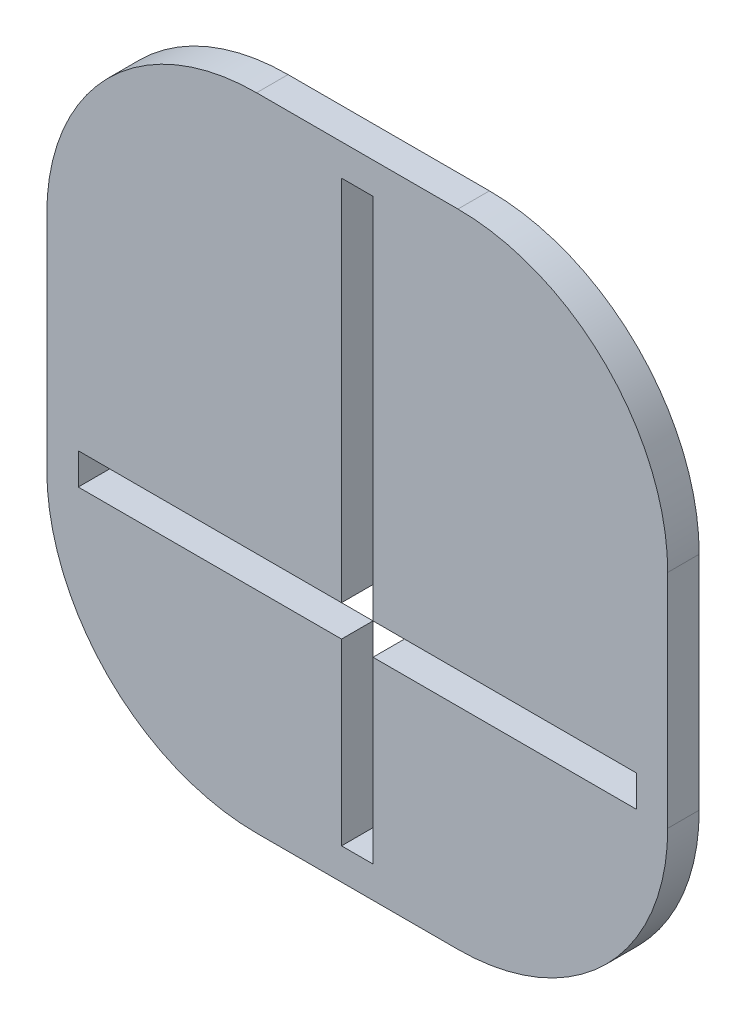
ISO-10303-21;
HEADER;
FILE_DESCRIPTION(('STEP AP214'),'2;1');
FILE_NAME('part.step','',(''),(''),'','','');
FILE_SCHEMA(('AUTOMOTIVE_DESIGN { 1 0 10303 214 1 1 1 1 }'));
ENDSEC;
DATA;
#1=APPLICATION_CONTEXT('core data for automotive mechanical design processes');
#2=APPLICATION_PROTOCOL_DEFINITION('international standard','automotive_design',2000,#1);
#3=PRODUCT_CONTEXT('',#1,'mechanical');
#4=PRODUCT('Part','Part','',(#3));
#5=PRODUCT_RELATED_PRODUCT_CATEGORY('part','',(#4));
#6=PRODUCT_DEFINITION_FORMATION('','',#4);
#7=PRODUCT_DEFINITION_CONTEXT('part definition',#1,'design');
#8=PRODUCT_DEFINITION('design','',#6,#7);
#9=PRODUCT_DEFINITION_SHAPE('','',#8);
#10=(LENGTH_UNIT() NAMED_UNIT(*) SI_UNIT(.MILLI.,.METRE.));
#11=(NAMED_UNIT(*) PLANE_ANGLE_UNIT() SI_UNIT($,.RADIAN.));
#12=(NAMED_UNIT(*) SI_UNIT($,.STERADIAN.) SOLID_ANGLE_UNIT());
#13=UNCERTAINTY_MEASURE_WITH_UNIT(LENGTH_MEASURE(1.E-05),#10,'distance_accuracy_value','');
#14=(GEOMETRIC_REPRESENTATION_CONTEXT(3) GLOBAL_UNCERTAINTY_ASSIGNED_CONTEXT((#13)) GLOBAL_UNIT_ASSIGNED_CONTEXT((#10,
#11,#12)) REPRESENTATION_CONTEXT('',''));
#15=CARTESIAN_POINT('',(0.,0.,0.));
#16=DIRECTION('',(0.,0.,1.));
#17=DIRECTION('',(1.,0.,0.));
#18=AXIS2_PLACEMENT_3D('',#15,#16,#17);
#19=CARTESIAN_POINT('',(0.,30.565,3.));
#20=DIRECTION('',(0.,-1.,0.));
#21=DIRECTION('',(1.,0.,0.));
#22=AXIS2_PLACEMENT_3D('',#19,#20,#21);
#23=PLANE('',#22);
#24=DIRECTION('',(-1.,0.,0.));
#25=VECTOR('',#24,1.);
#26=CARTESIAN_POINT('',(0.,30.565,0.));
#27=LINE('',#26,#25);
#28=CARTESIAN_POINT('',(9.59999999999999,30.565,0.));
#29=VERTEX_POINT('',#28);
#30=CARTESIAN_POINT('',(-9.60000000000003,30.565,0.));
#31=VERTEX_POINT('',#30);
#32=EDGE_CURVE('E254',#29,#31,#27,.T.);
#33=ORIENTED_EDGE('',*,*,#32,.T.);
#34=DIRECTION('',(0.,0.,-1.));
#35=VECTOR('',#34,1.);
#36=CARTESIAN_POINT('',(-9.60000000000003,30.565,3.));
#37=LINE('',#36,#35);
#38=CARTESIAN_POINT('',(-9.60000000000003,30.565,3.));
#39=VERTEX_POINT('',#38);
#40=EDGE_CURVE('E11',#39,#31,#37,.T.);
#41=ORIENTED_EDGE('',*,*,#40,.F.);
#42=DIRECTION('',(-1.,0.,0.));
#43=VECTOR('',#42,1.);
#44=CARTESIAN_POINT('',(0.,30.565,3.));
#45=LINE('',#44,#43);
#46=CARTESIAN_POINT('',(9.59999999999999,30.565,3.));
#47=VERTEX_POINT('',#46);
#48=EDGE_CURVE('E405',#47,#39,#45,.T.);
#49=ORIENTED_EDGE('',*,*,#48,.F.);
#50=DIRECTION('',(0.,0.,-1.));
#51=VECTOR('',#50,1.);
#52=CARTESIAN_POINT('',(9.59999999999999,30.565,3.));
#53=LINE('',#52,#51);
#54=EDGE_CURVE('E281',#47,#29,#53,.T.);
#55=ORIENTED_EDGE('',*,*,#54,.T.);
#56=EDGE_LOOP('',(#33,#41,#49,#55));
#57=FACE_BOUND('',#56,.T.);
#58=ADVANCED_FACE('F45',(#57),#23,.F.);
#59=CARTESIAN_POINT('',(-9.60000000000003,10.565,3.));
#60=DIRECTION('',(0.,0.,-1.));
#61=DIRECTION('',(-1.,0.,0.));
#62=AXIS2_PLACEMENT_3D('',#59,#60,#61);
#63=CYLINDRICAL_SURFACE('',#62,20.);
#64=CARTESIAN_POINT('',(-9.60000000000003,10.565,0.));
#65=DIRECTION('',(0.,0.,1.));
#66=DIRECTION('',(1.,0.,0.));
#67=AXIS2_PLACEMENT_3D('',#64,#65,#66);
#68=CIRCLE('',#67,20.);
#69=CARTESIAN_POINT('',(-29.6,10.565,0.));
#70=VERTEX_POINT('',#69);
#71=EDGE_CURVE('E258',#31,#70,#68,.T.);
#72=ORIENTED_EDGE('',*,*,#71,.T.);
#73=DIRECTION('',(0.,0.,-1.));
#74=VECTOR('',#73,1.);
#75=CARTESIAN_POINT('',(-29.6,10.565,3.));
#76=LINE('',#75,#74);
#77=CARTESIAN_POINT('',(-29.6,10.565,3.));
#78=VERTEX_POINT('',#77);
#79=EDGE_CURVE('E56',#78,#70,#76,.T.);
#80=ORIENTED_EDGE('',*,*,#79,.F.);
#81=CARTESIAN_POINT('',(-9.60000000000003,10.565,3.));
#82=DIRECTION('',(0.,0.,1.));
#83=DIRECTION('',(1.,0.,0.));
#84=AXIS2_PLACEMENT_3D('',#81,#82,#83);
#85=CIRCLE('',#84,20.);
#86=EDGE_CURVE('E408',#39,#78,#85,.T.);
#87=ORIENTED_EDGE('',*,*,#86,.F.);
#88=ORIENTED_EDGE('',*,*,#40,.T.);
#89=EDGE_LOOP('',(#72,#80,#87,#88));
#90=FACE_BOUND('',#89,.T.);
#91=ADVANCED_FACE('F440',(#90),#63,.T.);
#92=CARTESIAN_POINT('',(-29.6,0.,3.));
#93=DIRECTION('',(-1.,0.,0.));
#94=DIRECTION('',(0.,-1.,0.));
#95=AXIS2_PLACEMENT_3D('',#92,#93,#94);
#96=PLANE('',#95);
#97=DIRECTION('',(0.,1.,0.));
#98=VECTOR('',#97,1.);
#99=CARTESIAN_POINT('',(-29.6,0.,0.));
#100=LINE('',#99,#98);
#101=CARTESIAN_POINT('',(-29.6,-10.565,0.));
#102=VERTEX_POINT('',#101);
#103=EDGE_CURVE('E262',#102,#70,#100,.T.);
#104=ORIENTED_EDGE('',*,*,#103,.F.);
#105=DIRECTION('',(0.,0.,-1.));
#106=VECTOR('',#105,1.);
#107=CARTESIAN_POINT('',(-29.6,-10.565,3.));
#108=LINE('',#107,#106);
#109=CARTESIAN_POINT('',(-29.6,-10.565,3.));
#110=VERTEX_POINT('',#109);
#111=EDGE_CURVE('E291',#110,#102,#108,.T.);
#112=ORIENTED_EDGE('',*,*,#111,.F.);
#113=DIRECTION('',(0.,1.,0.));
#114=VECTOR('',#113,1.);
#115=CARTESIAN_POINT('',(-29.6,0.,3.));
#116=LINE('',#115,#114);
#117=EDGE_CURVE('E411',#110,#78,#116,.T.);
#118=ORIENTED_EDGE('',*,*,#117,.T.);
#119=ORIENTED_EDGE('',*,*,#79,.T.);
#120=EDGE_LOOP('',(#104,#112,#118,#119));
#121=FACE_BOUND('',#120,.T.);
#122=ADVANCED_FACE('F445',(#121),#96,.T.);
#123=CARTESIAN_POINT('',(-9.60000000000002,-10.565,3.));
#124=DIRECTION('',(0.,0.,-1.));
#125=DIRECTION('',(-1.,0.,0.));
#126=AXIS2_PLACEMENT_3D('',#123,#124,#125);
#127=CYLINDRICAL_SURFACE('',#126,20.);
#128=CARTESIAN_POINT('',(-9.60000000000002,-10.565,0.));
#129=DIRECTION('',(0.,0.,1.));
#130=DIRECTION('',(1.,0.,0.));
#131=AXIS2_PLACEMENT_3D('',#128,#129,#130);
#132=CIRCLE('',#131,20.);
#133=CARTESIAN_POINT('',(-9.60000000000002,-30.565,0.));
#134=VERTEX_POINT('',#133);
#135=EDGE_CURVE('E266',#134,#102,#132,.F.);
#136=ORIENTED_EDGE('',*,*,#135,.F.);
#137=DIRECTION('',(0.,0.,-1.));
#138=VECTOR('',#137,1.);
#139=CARTESIAN_POINT('',(-9.60000000000002,-30.565,3.));
#140=LINE('',#139,#138);
#141=CARTESIAN_POINT('',(-9.60000000000002,-30.565,3.));
#142=VERTEX_POINT('',#141);
#143=EDGE_CURVE('E288',#142,#134,#140,.T.);
#144=ORIENTED_EDGE('',*,*,#143,.F.);
#145=CARTESIAN_POINT('',(-9.60000000000002,-10.565,3.));
#146=DIRECTION('',(0.,0.,1.));
#147=DIRECTION('',(1.,0.,0.));
#148=AXIS2_PLACEMENT_3D('',#145,#146,#147);
#149=CIRCLE('',#148,20.);
#150=EDGE_CURVE('E415',#142,#110,#149,.F.);
#151=ORIENTED_EDGE('',*,*,#150,.T.);
#152=ORIENTED_EDGE('',*,*,#111,.T.);
#153=EDGE_LOOP('',(#136,#144,#151,#152));
#154=FACE_BOUND('',#153,.T.);
#155=ADVANCED_FACE('F608',(#154),#127,.T.);
#156=CARTESIAN_POINT('',(0.,-30.565,3.));
#157=DIRECTION('',(0.,-1.,0.));
#158=DIRECTION('',(1.,0.,0.));
#159=AXIS2_PLACEMENT_3D('',#156,#157,#158);
#160=PLANE('',#159);
#161=DIRECTION('',(-1.,0.,0.));
#162=VECTOR('',#161,1.);
#163=CARTESIAN_POINT('',(0.,-30.565,0.));
#164=LINE('',#163,#162);
#165=CARTESIAN_POINT('',(9.60000000000002,-30.565,0.));
#166=VERTEX_POINT('',#165);
#167=EDGE_CURVE('E270',#166,#134,#164,.T.);
#168=ORIENTED_EDGE('',*,*,#167,.F.);
#169=DIRECTION('',(0.,0.,-1.));
#170=VECTOR('',#169,1.);
#171=CARTESIAN_POINT('',(9.60000000000002,-30.565,3.));
#172=LINE('',#171,#170);
#173=CARTESIAN_POINT('',(9.60000000000002,-30.565,3.));
#174=VERTEX_POINT('',#173);
#175=EDGE_CURVE('E212',#174,#166,#172,.T.);
#176=ORIENTED_EDGE('',*,*,#175,.F.);
#177=DIRECTION('',(-1.,0.,0.));
#178=VECTOR('',#177,1.);
#179=CARTESIAN_POINT('',(0.,-30.565,3.));
#180=LINE('',#179,#178);
#181=EDGE_CURVE('E203',#174,#142,#180,.T.);
#182=ORIENTED_EDGE('',*,*,#181,.T.);
#183=ORIENTED_EDGE('',*,*,#143,.T.);
#184=EDGE_LOOP('',(#168,#176,#182,#183));
#185=FACE_BOUND('',#184,.T.);
#186=ADVANCED_FACE('F421',(#185),#160,.T.);
#187=CARTESIAN_POINT('',(9.6,-10.565,3.));
#188=DIRECTION('',(0.,0.,-1.));
#189=DIRECTION('',(-1.,0.,0.));
#190=AXIS2_PLACEMENT_3D('',#187,#188,#189);
#191=CYLINDRICAL_SURFACE('',#190,20.);
#192=CARTESIAN_POINT('',(9.6,-10.565,0.));
#193=DIRECTION('',(0.,0.,1.));
#194=DIRECTION('',(1.,0.,0.));
#195=AXIS2_PLACEMENT_3D('',#192,#193,#194);
#196=CIRCLE('',#195,20.);
#197=CARTESIAN_POINT('',(29.6,-10.565,0.));
#198=VERTEX_POINT('',#197);
#199=EDGE_CURVE('E210',#166,#198,#196,.T.);
#200=ORIENTED_EDGE('',*,*,#199,.T.);
#201=DIRECTION('',(0.,0.,-1.));
#202=VECTOR('',#201,1.);
#203=CARTESIAN_POINT('',(29.6,-10.565,3.));
#204=LINE('',#203,#202);
#205=CARTESIAN_POINT('',(29.6,-10.565,3.));
#206=VERTEX_POINT('',#205);
#207=EDGE_CURVE('E207',#206,#198,#204,.T.);
#208=ORIENTED_EDGE('',*,*,#207,.F.);
#209=CARTESIAN_POINT('',(9.6,-10.565,3.));
#210=DIRECTION('',(0.,0.,1.));
#211=DIRECTION('',(1.,0.,0.));
#212=AXIS2_PLACEMENT_3D('',#209,#210,#211);
#213=CIRCLE('',#212,20.);
#214=EDGE_CURVE('E196',#174,#206,#213,.T.);
#215=ORIENTED_EDGE('',*,*,#214,.F.);
#216=ORIENTED_EDGE('',*,*,#175,.T.);
#217=EDGE_LOOP('',(#200,#208,#215,#216));
#218=FACE_BOUND('',#217,.T.);
#219=ADVANCED_FACE('F208',(#218),#191,.T.);
#220=CARTESIAN_POINT('',(29.6,0.,3.));
#221=DIRECTION('',(-1.,0.,0.));
#222=DIRECTION('',(0.,-1.,0.));
#223=AXIS2_PLACEMENT_3D('',#220,#221,#222);
#224=PLANE('',#223);
#225=DIRECTION('',(0.,1.,0.));
#226=VECTOR('',#225,1.);
#227=CARTESIAN_POINT('',(29.6,0.,0.));
#228=LINE('',#227,#226);
#229=CARTESIAN_POINT('',(29.6,10.565,0.));
#230=VERTEX_POINT('',#229);
#231=EDGE_CURVE('E130',#198,#230,#228,.T.);
#232=ORIENTED_EDGE('',*,*,#231,.T.);
#233=DIRECTION('',(0.,0.,-1.));
#234=VECTOR('',#233,1.);
#235=CARTESIAN_POINT('',(29.6,10.565,3.));
#236=LINE('',#235,#234);
#237=CARTESIAN_POINT('',(29.6,10.565,3.));
#238=VERTEX_POINT('',#237);
#239=EDGE_CURVE('E213',#238,#230,#236,.T.);
#240=ORIENTED_EDGE('',*,*,#239,.F.);
#241=DIRECTION('',(0.,1.,0.));
#242=VECTOR('',#241,1.);
#243=CARTESIAN_POINT('',(29.6,0.,3.));
#244=LINE('',#243,#242);
#245=EDGE_CURVE('E200',#206,#238,#244,.T.);
#246=ORIENTED_EDGE('',*,*,#245,.F.);
#247=ORIENTED_EDGE('',*,*,#207,.T.);
#248=EDGE_LOOP('',(#232,#240,#246,#247));
#249=FACE_BOUND('',#248,.T.);
#250=ADVANCED_FACE('F215',(#249),#224,.F.);
#251=CARTESIAN_POINT('',(0.,27.565,3.));
#252=DIRECTION('',(0.,1.,0.));
#253=DIRECTION('',(0.,0.,1.));
#254=AXIS2_PLACEMENT_3D('',#251,#252,#253);
#255=PLANE('',#254);
#256=DIRECTION('',(1.,0.,0.));
#257=VECTOR('',#256,1.);
#258=CARTESIAN_POINT('',(0.,27.565,0.));
#259=LINE('',#258,#257);
#260=CARTESIAN_POINT('',(-1.50000000000001,27.565,0.));
#261=VERTEX_POINT('',#260);
#262=CARTESIAN_POINT('',(1.50000000000001,27.565,0.));
#263=VERTEX_POINT('',#262);
#264=EDGE_CURVE('E223',#261,#263,#259,.T.);
#265=ORIENTED_EDGE('',*,*,#264,.T.);
#266=DIRECTION('',(0.,0.,-1.));
#267=VECTOR('',#266,1.);
#268=CARTESIAN_POINT('',(1.50000000000001,27.565,3.));
#269=LINE('',#268,#267);
#270=CARTESIAN_POINT('',(1.50000000000001,27.565,3.));
#271=VERTEX_POINT('',#270);
#272=EDGE_CURVE('E49',#271,#263,#269,.T.);
#273=ORIENTED_EDGE('',*,*,#272,.F.);
#274=DIRECTION('',(1.,0.,0.));
#275=VECTOR('',#274,1.);
#276=CARTESIAN_POINT('',(0.,27.565,3.));
#277=LINE('',#276,#275);
#278=CARTESIAN_POINT('',(-1.50000000000001,27.565,3.));
#279=VERTEX_POINT('',#278);
#280=EDGE_CURVE('E280',#279,#271,#277,.T.);
#281=ORIENTED_EDGE('',*,*,#280,.F.);
#282=DIRECTION('',(0.,0.,-1.));
#283=VECTOR('',#282,1.);
#284=CARTESIAN_POINT('',(-1.50000000000001,27.565,3.));
#285=LINE('',#284,#283);
#286=EDGE_CURVE('E219',#279,#261,#285,.T.);
#287=ORIENTED_EDGE('',*,*,#286,.T.);
#288=EDGE_LOOP('',(#265,#273,#281,#287));
#289=FACE_BOUND('',#288,.T.);
#290=ADVANCED_FACE('F47',(#289),#255,.F.);
#291=CARTESIAN_POINT('',(1.50000000000001,0.,3.));
#292=DIRECTION('',(1.,0.,0.));
#293=DIRECTION('',(0.,0.,-1.));
#294=AXIS2_PLACEMENT_3D('',#291,#292,#293);
#295=PLANE('',#294);
#296=DIRECTION('',(0.,-1.,0.));
#297=VECTOR('',#296,1.);
#298=CARTESIAN_POINT('',(1.50000000000001,0.,0.));
#299=LINE('',#298,#297);
#300=CARTESIAN_POINT('',(1.50000000000001,-7.49000000000001,0.));
#301=VERTEX_POINT('',#300);
#302=EDGE_CURVE('E227',#263,#301,#299,.T.);
#303=ORIENTED_EDGE('',*,*,#302,.T.);
#304=DIRECTION('',(0.,0.,-1.));
#305=VECTOR('',#304,1.);
#306=CARTESIAN_POINT('',(1.50000000000001,-7.49000000000001,3.));
#307=LINE('',#306,#305);
#308=CARTESIAN_POINT('',(1.50000000000001,-7.49000000000001,3.));
#309=VERTEX_POINT('',#308);
#310=EDGE_CURVE('E329',#309,#301,#307,.T.);
#311=ORIENTED_EDGE('',*,*,#310,.F.);
#312=DIRECTION('',(0.,-1.,0.));
#313=VECTOR('',#312,1.);
#314=CARTESIAN_POINT('',(1.50000000000001,0.,3.));
#315=LINE('',#314,#313);
#316=EDGE_CURVE('E145',#271,#309,#315,.T.);
#317=ORIENTED_EDGE('',*,*,#316,.F.);
#318=ORIENTED_EDGE('',*,*,#272,.T.);
#319=EDGE_LOOP('',(#303,#311,#317,#318));
#320=FACE_BOUND('',#319,.T.);
#321=ADVANCED_FACE('F337',(#320),#295,.F.);
#322=CARTESIAN_POINT('',(0.,-7.49000000000001,3.));
#323=DIRECTION('',(0.,1.,0.));
#324=DIRECTION('',(0.,0.,1.));
#325=AXIS2_PLACEMENT_3D('',#322,#323,#324);
#326=PLANE('',#325);
#327=DIRECTION('',(1.,0.,0.));
#328=VECTOR('',#327,1.);
#329=CARTESIAN_POINT('',(0.,-7.49000000000001,0.));
#330=LINE('',#329,#328);
#331=CARTESIAN_POINT('',(26.6,-7.49000000000001,0.));
#332=VERTEX_POINT('',#331);
#333=EDGE_CURVE('E230',#301,#332,#330,.T.);
#334=ORIENTED_EDGE('',*,*,#333,.T.);
#335=DIRECTION('',(0.,0.,-1.));
#336=VECTOR('',#335,1.);
#337=CARTESIAN_POINT('',(26.6,-7.49000000000001,3.));
#338=LINE('',#337,#336);
#339=CARTESIAN_POINT('',(26.6,-7.49000000000001,3.));
#340=VERTEX_POINT('',#339);
#341=EDGE_CURVE('E326',#340,#332,#338,.T.);
#342=ORIENTED_EDGE('',*,*,#341,.F.);
#343=DIRECTION('',(1.,0.,0.));
#344=VECTOR('',#343,1.);
#345=CARTESIAN_POINT('',(0.,-7.49000000000001,3.));
#346=LINE('',#345,#344);
#347=EDGE_CURVE('E477',#309,#340,#346,.T.);
#348=ORIENTED_EDGE('',*,*,#347,.F.);
#349=ORIENTED_EDGE('',*,*,#310,.T.);
#350=EDGE_LOOP('',(#334,#342,#348,#349));
#351=FACE_BOUND('',#350,.T.);
#352=ADVANCED_FACE('F452',(#351),#326,.F.);
#353=CARTESIAN_POINT('',(26.6,0.,3.));
#354=DIRECTION('',(1.,0.,0.));
#355=DIRECTION('',(0.,1.,0.));
#356=AXIS2_PLACEMENT_3D('',#353,#354,#355);
#357=PLANE('',#356);
#358=DIRECTION('',(0.,-1.,0.));
#359=VECTOR('',#358,1.);
#360=CARTESIAN_POINT('',(26.6,0.,0.));
#361=LINE('',#360,#359);
#362=CARTESIAN_POINT('',(26.6,-10.49,0.));
#363=VERTEX_POINT('',#362);
#364=EDGE_CURVE('E234',#332,#363,#361,.T.);
#365=ORIENTED_EDGE('',*,*,#364,.T.);
#366=DIRECTION('',(0.,0.,-1.));
#367=VECTOR('',#366,1.);
#368=CARTESIAN_POINT('',(26.6,-10.49,3.));
#369=LINE('',#368,#367);
#370=CARTESIAN_POINT('',(26.6,-10.49,3.));
#371=VERTEX_POINT('',#370);
#372=EDGE_CURVE('E322',#371,#363,#369,.T.);
#373=ORIENTED_EDGE('',*,*,#372,.F.);
#374=DIRECTION('',(0.,-1.,0.));
#375=VECTOR('',#374,1.);
#376=CARTESIAN_POINT('',(26.6,0.,3.));
#377=LINE('',#376,#375);
#378=EDGE_CURVE('E475',#340,#371,#377,.T.);
#379=ORIENTED_EDGE('',*,*,#378,.F.);
#380=ORIENTED_EDGE('',*,*,#341,.T.);
#381=EDGE_LOOP('',(#365,#373,#379,#380));
#382=FACE_BOUND('',#381,.T.);
#383=ADVANCED_FACE('F461',(#382),#357,.F.);
#384=CARTESIAN_POINT('',(0.,-10.49,3.));
#385=DIRECTION('',(0.,-1.,0.));
#386=DIRECTION('',(0.,0.,-1.));
#387=AXIS2_PLACEMENT_3D('',#384,#385,#386);
#388=PLANE('',#387);
#389=DIRECTION('',(-1.,0.,0.));
#390=VECTOR('',#389,1.);
#391=CARTESIAN_POINT('',(0.,-10.49,0.));
#392=LINE('',#391,#390);
#393=CARTESIAN_POINT('',(1.50000000000001,-10.49,0.));
#394=VERTEX_POINT('',#393);
#395=EDGE_CURVE('E238',#363,#394,#392,.T.);
#396=ORIENTED_EDGE('',*,*,#395,.T.);
#397=DIRECTION('',(0.,0.,-1.));
#398=VECTOR('',#397,1.);
#399=CARTESIAN_POINT('',(1.50000000000001,-10.49,3.));
#400=LINE('',#399,#398);
#401=CARTESIAN_POINT('',(1.50000000000001,-10.49,3.));
#402=VERTEX_POINT('',#401);
#403=EDGE_CURVE('E318',#402,#394,#400,.T.);
#404=ORIENTED_EDGE('',*,*,#403,.F.);
#405=DIRECTION('',(-1.,0.,0.));
#406=VECTOR('',#405,1.);
#407=CARTESIAN_POINT('',(0.,-10.49,3.));
#408=LINE('',#407,#406);
#409=EDGE_CURVE('E397',#371,#402,#408,.T.);
#410=ORIENTED_EDGE('',*,*,#409,.F.);
#411=ORIENTED_EDGE('',*,*,#372,.T.);
#412=EDGE_LOOP('',(#396,#404,#410,#411));
#413=FACE_BOUND('',#412,.T.);
#414=ADVANCED_FACE('F457',(#413),#388,.F.);
#415=CARTESIAN_POINT('',(1.50000000000001,-27.565,0.));
#416=VERTEX_POINT('',#415);
#417=EDGE_CURVE('E231',#394,#416,#299,.T.);
#418=ORIENTED_EDGE('',*,*,#417,.T.);
#419=DIRECTION('',(0.,0.,-1.));
#420=VECTOR('',#419,1.);
#421=CARTESIAN_POINT('',(1.50000000000001,-27.565,3.));
#422=LINE('',#421,#420);
#423=CARTESIAN_POINT('',(1.50000000000001,-27.565,3.));
#424=VERTEX_POINT('',#423);
#425=EDGE_CURVE('E315',#424,#416,#422,.T.);
#426=ORIENTED_EDGE('',*,*,#425,.F.);
#427=EDGE_CURVE('E391',#402,#424,#315,.T.);
#428=ORIENTED_EDGE('',*,*,#427,.F.);
#429=ORIENTED_EDGE('',*,*,#403,.T.);
#430=EDGE_LOOP('',(#418,#426,#428,#429));
#431=FACE_BOUND('',#430,.T.);
#432=ADVANCED_FACE('F377',(#431),#295,.F.);
#433=CARTESIAN_POINT('',(0.,-27.565,3.));
#434=DIRECTION('',(0.,1.,0.));
#435=DIRECTION('',(0.,0.,1.));
#436=AXIS2_PLACEMENT_3D('',#433,#434,#435);
#437=PLANE('',#436);
#438=DIRECTION('',(1.,0.,0.));
#439=VECTOR('',#438,1.);
#440=CARTESIAN_POINT('',(0.,-27.565,0.));
#441=LINE('',#440,#439);
#442=CARTESIAN_POINT('',(-1.50000000000001,-27.565,0.));
#443=VERTEX_POINT('',#442);
#444=EDGE_CURVE('E242',#443,#416,#441,.T.);
#445=ORIENTED_EDGE('',*,*,#444,.F.);
#446=DIRECTION('',(0.,0.,-1.));
#447=VECTOR('',#446,1.);
#448=CARTESIAN_POINT('',(-1.50000000000001,-27.565,3.));
#449=LINE('',#448,#447);
#450=CARTESIAN_POINT('',(-1.50000000000001,-27.565,3.));
#451=VERTEX_POINT('',#450);
#452=EDGE_CURVE('E312',#451,#443,#449,.T.);
#453=ORIENTED_EDGE('',*,*,#452,.F.);
#454=DIRECTION('',(1.,0.,0.));
#455=VECTOR('',#454,1.);
#456=CARTESIAN_POINT('',(0.,-27.565,3.));
#457=LINE('',#456,#455);
#458=EDGE_CURVE('E386',#451,#424,#457,.T.);
#459=ORIENTED_EDGE('',*,*,#458,.T.);
#460=ORIENTED_EDGE('',*,*,#425,.T.);
#461=EDGE_LOOP('',(#445,#453,#459,#460));
#462=FACE_BOUND('',#461,.T.);
#463=ADVANCED_FACE('F384',(#462),#437,.T.);
#464=CARTESIAN_POINT('',(-1.50000000000001,0.,3.));
#465=DIRECTION('',(1.,0.,0.));
#466=DIRECTION('',(0.,0.,-1.));
#467=AXIS2_PLACEMENT_3D('',#464,#465,#466);
#468=PLANE('',#467);
#469=DIRECTION('',(0.,-1.,0.));
#470=VECTOR('',#469,1.);
#471=CARTESIAN_POINT('',(-1.50000000000001,0.,0.));
#472=LINE('',#471,#470);
#473=CARTESIAN_POINT('',(-1.50000000000001,-10.49,0.));
#474=VERTEX_POINT('',#473);
#475=EDGE_CURVE('E246',#474,#443,#472,.T.);
#476=ORIENTED_EDGE('',*,*,#475,.F.);
#477=DIRECTION('',(0.,0.,-1.));
#478=VECTOR('',#477,1.);
#479=CARTESIAN_POINT('',(-1.50000000000001,-10.49,3.));
#480=LINE('',#479,#478);
#481=CARTESIAN_POINT('',(-1.50000000000001,-10.49,3.));
#482=VERTEX_POINT('',#481);
#483=EDGE_CURVE('E309',#482,#474,#480,.T.);
#484=ORIENTED_EDGE('',*,*,#483,.F.);
#485=DIRECTION('',(0.,-1.,0.));
#486=VECTOR('',#485,1.);
#487=CARTESIAN_POINT('',(-1.50000000000001,0.,3.));
#488=LINE('',#487,#486);
#489=EDGE_CURVE('E390',#482,#451,#488,.T.);
#490=ORIENTED_EDGE('',*,*,#489,.T.);
#491=ORIENTED_EDGE('',*,*,#452,.T.);
#492=EDGE_LOOP('',(#476,#484,#490,#491));
#493=FACE_BOUND('',#492,.T.);
#494=ADVANCED_FACE('F436',(#493),#468,.T.);
#495=CARTESIAN_POINT('',(-26.6,-10.49,0.));
#496=VERTEX_POINT('',#495);
#497=EDGE_CURVE('E241',#474,#496,#392,.T.);
#498=ORIENTED_EDGE('',*,*,#497,.T.);
#499=DIRECTION('',(0.,0.,-1.));
#500=VECTOR('',#499,1.);
#501=CARTESIAN_POINT('',(-26.6,-10.49,3.));
#502=LINE('',#501,#500);
#503=CARTESIAN_POINT('',(-26.6,-10.49,3.));
#504=VERTEX_POINT('',#503);
#505=EDGE_CURVE('E305',#504,#496,#502,.T.);
#506=ORIENTED_EDGE('',*,*,#505,.F.);
#507=EDGE_CURVE('E369',#482,#504,#408,.T.);
#508=ORIENTED_EDGE('',*,*,#507,.F.);
#509=ORIENTED_EDGE('',*,*,#483,.T.);
#510=EDGE_LOOP('',(#498,#506,#508,#509));
#511=FACE_BOUND('',#510,.T.);
#512=ADVANCED_FACE('F368',(#511),#388,.F.);
#513=CARTESIAN_POINT('',(-26.6,0.,3.));
#514=DIRECTION('',(-1.,0.,0.));
#515=DIRECTION('',(0.,-1.,0.));
#516=AXIS2_PLACEMENT_3D('',#513,#514,#515);
#517=PLANE('',#516);
#518=DIRECTION('',(0.,1.,0.));
#519=VECTOR('',#518,1.);
#520=CARTESIAN_POINT('',(-26.6,0.,0.));
#521=LINE('',#520,#519);
#522=CARTESIAN_POINT('',(-26.6,-7.49000000000001,0.));
#523=VERTEX_POINT('',#522);
#524=EDGE_CURVE('E251',#496,#523,#521,.T.);
#525=ORIENTED_EDGE('',*,*,#524,.T.);
#526=DIRECTION('',(0.,0.,-1.));
#527=VECTOR('',#526,1.);
#528=CARTESIAN_POINT('',(-26.6,-7.49000000000001,3.));
#529=LINE('',#528,#527);
#530=CARTESIAN_POINT('',(-26.6,-7.49000000000001,3.));
#531=VERTEX_POINT('',#530);
#532=EDGE_CURVE('E301',#531,#523,#529,.T.);
#533=ORIENTED_EDGE('',*,*,#532,.F.);
#534=DIRECTION('',(0.,1.,0.));
#535=VECTOR('',#534,1.);
#536=CARTESIAN_POINT('',(-26.6,0.,3.));
#537=LINE('',#536,#535);
#538=EDGE_CURVE('E365',#504,#531,#537,.T.);
#539=ORIENTED_EDGE('',*,*,#538,.F.);
#540=ORIENTED_EDGE('',*,*,#505,.T.);
#541=EDGE_LOOP('',(#525,#533,#539,#540));
#542=FACE_BOUND('',#541,.T.);
#543=ADVANCED_FACE('F362',(#542),#517,.F.);
#544=CARTESIAN_POINT('',(-1.50000000000001,-7.49000000000001,0.));
#545=VERTEX_POINT('',#544);
#546=EDGE_CURVE('E235',#523,#545,#330,.T.);
#547=ORIENTED_EDGE('',*,*,#546,.T.);
#548=DIRECTION('',(0.,0.,-1.));
#549=VECTOR('',#548,1.);
#550=CARTESIAN_POINT('',(-1.50000000000001,-7.49000000000001,3.));
#551=LINE('',#550,#549);
#552=CARTESIAN_POINT('',(-1.50000000000001,-7.49000000000001,3.));
#553=VERTEX_POINT('',#552);
#554=EDGE_CURVE('E298',#553,#545,#551,.T.);
#555=ORIENTED_EDGE('',*,*,#554,.F.);
#556=EDGE_CURVE('E404',#531,#553,#346,.T.);
#557=ORIENTED_EDGE('',*,*,#556,.F.);
#558=ORIENTED_EDGE('',*,*,#532,.T.);
#559=EDGE_LOOP('',(#547,#555,#557,#558));
#560=FACE_BOUND('',#559,.T.);
#561=ADVANCED_FACE('F355',(#560),#326,.F.);
#562=EDGE_CURVE('E250',#261,#545,#472,.T.);
#563=ORIENTED_EDGE('',*,*,#562,.F.);
#564=ORIENTED_EDGE('',*,*,#286,.F.);
#565=EDGE_CURVE('E396',#279,#553,#488,.T.);
#566=ORIENTED_EDGE('',*,*,#565,.T.);
#567=ORIENTED_EDGE('',*,*,#554,.T.);
#568=EDGE_LOOP('',(#563,#564,#566,#567));
#569=FACE_BOUND('',#568,.T.);
#570=ADVANCED_FACE('F348',(#569),#468,.T.);
#571=CARTESIAN_POINT('',(9.6,10.565,3.));
#572=DIRECTION('',(0.,0.,-1.));
#573=DIRECTION('',(-1.,0.,0.));
#574=AXIS2_PLACEMENT_3D('',#571,#572,#573);
#575=CYLINDRICAL_SURFACE('',#574,20.);
#576=CARTESIAN_POINT('',(9.6,10.565,0.));
#577=DIRECTION('',(0.,0.,1.));
#578=DIRECTION('',(1.,0.,0.));
#579=AXIS2_PLACEMENT_3D('',#576,#577,#578);
#580=CIRCLE('',#579,20.);
#581=EDGE_CURVE('E136',#230,#29,#580,.T.);
#582=ORIENTED_EDGE('',*,*,#581,.T.);
#583=ORIENTED_EDGE('',*,*,#54,.F.);
#584=CARTESIAN_POINT('',(9.6,10.565,3.));
#585=DIRECTION('',(0.,0.,1.));
#586=DIRECTION('',(1.,0.,0.));
#587=AXIS2_PLACEMENT_3D('',#584,#585,#586);
#588=CIRCLE('',#587,20.);
#589=EDGE_CURVE('E65',#238,#47,#588,.T.);
#590=ORIENTED_EDGE('',*,*,#589,.F.);
#591=ORIENTED_EDGE('',*,*,#239,.T.);
#592=EDGE_LOOP('',(#582,#583,#590,#591));
#593=FACE_BOUND('',#592,.T.);
#594=ADVANCED_FACE('F427',(#593),#575,.T.);
#595=CARTESIAN_POINT('',(0.,0.,3.));
#596=DIRECTION('',(0.,0.,1.));
#597=DIRECTION('',(1.,0.,0.));
#598=AXIS2_PLACEMENT_3D('',#595,#596,#597);
#599=PLANE('',#598);
#600=ORIENTED_EDGE('',*,*,#280,.T.);
#601=ORIENTED_EDGE('',*,*,#316,.T.);
#602=ORIENTED_EDGE('',*,*,#347,.T.);
#603=ORIENTED_EDGE('',*,*,#378,.T.);
#604=ORIENTED_EDGE('',*,*,#409,.T.);
#605=ORIENTED_EDGE('',*,*,#427,.T.);
#606=ORIENTED_EDGE('',*,*,#458,.F.);
#607=ORIENTED_EDGE('',*,*,#489,.F.);
#608=ORIENTED_EDGE('',*,*,#507,.T.);
#609=ORIENTED_EDGE('',*,*,#538,.T.);
#610=ORIENTED_EDGE('',*,*,#556,.T.);
#611=ORIENTED_EDGE('',*,*,#565,.F.);
#612=EDGE_LOOP('',(#600,#601,#602,#603,#604,#605,#606,#607,#608,#609,#610,#611));
#613=FACE_BOUND('',#612,.T.);
#614=ORIENTED_EDGE('',*,*,#48,.T.);
#615=ORIENTED_EDGE('',*,*,#86,.T.);
#616=ORIENTED_EDGE('',*,*,#117,.F.);
#617=ORIENTED_EDGE('',*,*,#150,.F.);
#618=ORIENTED_EDGE('',*,*,#181,.F.);
#619=ORIENTED_EDGE('',*,*,#214,.T.);
#620=ORIENTED_EDGE('',*,*,#245,.T.);
#621=ORIENTED_EDGE('',*,*,#589,.T.);
#622=EDGE_LOOP('',(#614,#615,#616,#617,#618,#619,#620,#621));
#623=FACE_BOUND('',#622,.T.);
#624=ADVANCED_FACE('F198',(#613,#623),#599,.T.);
#625=CARTESIAN_POINT('',(0.,0.,0.));
#626=DIRECTION('',(0.,0.,1.));
#627=DIRECTION('',(1.,0.,0.));
#628=AXIS2_PLACEMENT_3D('',#625,#626,#627);
#629=PLANE('',#628);
#630=ORIENTED_EDGE('',*,*,#264,.F.);
#631=ORIENTED_EDGE('',*,*,#562,.T.);
#632=ORIENTED_EDGE('',*,*,#546,.F.);
#633=ORIENTED_EDGE('',*,*,#524,.F.);
#634=ORIENTED_EDGE('',*,*,#497,.F.);
#635=ORIENTED_EDGE('',*,*,#475,.T.);
#636=ORIENTED_EDGE('',*,*,#444,.T.);
#637=ORIENTED_EDGE('',*,*,#417,.F.);
#638=ORIENTED_EDGE('',*,*,#395,.F.);
#639=ORIENTED_EDGE('',*,*,#364,.F.);
#640=ORIENTED_EDGE('',*,*,#333,.F.);
#641=ORIENTED_EDGE('',*,*,#302,.F.);
#642=EDGE_LOOP('',(#630,#631,#632,#633,#634,#635,#636,#637,#638,#639,#640,#641));
#643=FACE_BOUND('',#642,.T.);
#644=ORIENTED_EDGE('',*,*,#32,.F.);
#645=ORIENTED_EDGE('',*,*,#581,.F.);
#646=ORIENTED_EDGE('',*,*,#231,.F.);
#647=ORIENTED_EDGE('',*,*,#199,.F.);
#648=ORIENTED_EDGE('',*,*,#167,.T.);
#649=ORIENTED_EDGE('',*,*,#135,.T.);
#650=ORIENTED_EDGE('',*,*,#103,.T.);
#651=ORIENTED_EDGE('',*,*,#71,.F.);
#652=EDGE_LOOP('',(#644,#645,#646,#647,#648,#649,#650,#651));
#653=FACE_BOUND('',#652,.T.);
#654=ADVANCED_FACE('F344',(#643,#653),#629,.F.);
#655=CLOSED_SHELL('',(#58,#91,#122,#155,#186,#219,#250,#290,#321,#352,#383,#414,#432,#463,#494,
#512,#543,#561,#570,#594,#624,#654));
#656=MANIFOLD_SOLID_BREP('B2',#655);
#657=ADVANCED_BREP_SHAPE_REPRESENTATION('',(#18,#656),#14);
#658=SHAPE_DEFINITION_REPRESENTATION(#9,#657);
ENDSEC;
END-ISO-10303-21;
